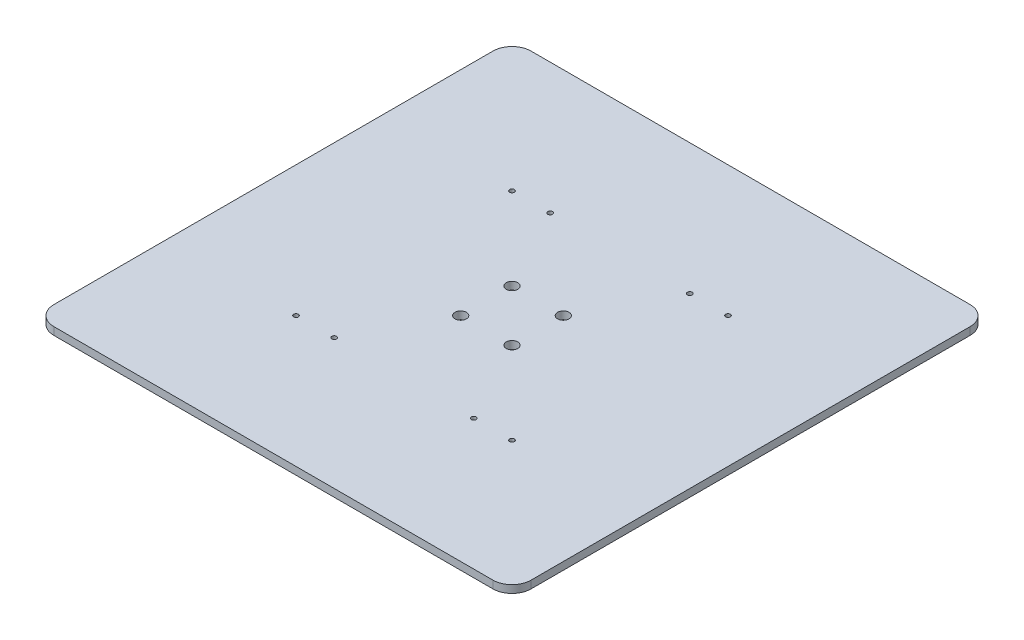
ISO-10303-21;
HEADER;
FILE_DESCRIPTION(('STEP AP214'),'2;1');
FILE_NAME('part.step','',(''),(''),'','','');
FILE_SCHEMA(('AUTOMOTIVE_DESIGN { 1 0 10303 214 1 1 1 1 }'));
ENDSEC;
DATA;
#1=APPLICATION_CONTEXT('core data for automotive mechanical design processes');
#2=APPLICATION_PROTOCOL_DEFINITION('international standard','automotive_design',2000,#1);
#3=PRODUCT_CONTEXT('',#1,'mechanical');
#4=PRODUCT('Part','Part','',(#3));
#5=PRODUCT_RELATED_PRODUCT_CATEGORY('part','',(#4));
#6=PRODUCT_DEFINITION_FORMATION('','',#4);
#7=PRODUCT_DEFINITION_CONTEXT('part definition',#1,'design');
#8=PRODUCT_DEFINITION('design','',#6,#7);
#9=PRODUCT_DEFINITION_SHAPE('','',#8);
#10=(LENGTH_UNIT() NAMED_UNIT(*) SI_UNIT(.MILLI.,.METRE.));
#11=(NAMED_UNIT(*) PLANE_ANGLE_UNIT() SI_UNIT($,.RADIAN.));
#12=(NAMED_UNIT(*) SI_UNIT($,.STERADIAN.) SOLID_ANGLE_UNIT());
#13=UNCERTAINTY_MEASURE_WITH_UNIT(LENGTH_MEASURE(1.E-05),#10,'distance_accuracy_value','');
#14=(GEOMETRIC_REPRESENTATION_CONTEXT(3) GLOBAL_UNCERTAINTY_ASSIGNED_CONTEXT((#13)) GLOBAL_UNIT_ASSIGNED_CONTEXT((#10,
#11,#12)) REPRESENTATION_CONTEXT('',''));
#15=CARTESIAN_POINT('',(0.,0.,0.));
#16=DIRECTION('',(0.,0.,1.));
#17=DIRECTION('',(1.,0.,0.));
#18=AXIS2_PLACEMENT_3D('',#15,#16,#17);
#19=CARTESIAN_POINT('',(125.,4.,-125.));
#20=DIRECTION('',(-1.,0.,0.));
#21=DIRECTION('',(0.,0.,1.));
#22=AXIS2_PLACEMENT_3D('',#19,#20,#21);
#23=PLANE('',#22);
#24=DIRECTION('',(0.,0.,-1.));
#25=VECTOR('',#24,1.);
#26=CARTESIAN_POINT('',(125.,4.,-125.));
#27=LINE('',#26,#25);
#28=CARTESIAN_POINT('',(125.,4.,115.));
#29=VERTEX_POINT('',#28);
#30=CARTESIAN_POINT('',(125.,4.,-115.));
#31=VERTEX_POINT('',#30);
#32=EDGE_CURVE('E140',#29,#31,#27,.T.);
#33=ORIENTED_EDGE('',*,*,#32,.F.);
#34=DIRECTION('',(0.,-1.,0.));
#35=VECTOR('',#34,1.);
#36=CARTESIAN_POINT('',(125.,4.,115.));
#37=LINE('',#36,#35);
#38=CARTESIAN_POINT('',(125.,0.,115.));
#39=VERTEX_POINT('',#38);
#40=EDGE_CURVE('E181',#29,#39,#37,.T.);
#41=ORIENTED_EDGE('',*,*,#40,.T.);
#42=DIRECTION('',(0.,0.,-1.));
#43=VECTOR('',#42,1.);
#44=CARTESIAN_POINT('',(125.,0.,-125.));
#45=LINE('',#44,#43);
#46=CARTESIAN_POINT('',(125.,0.,-115.));
#47=VERTEX_POINT('',#46);
#48=EDGE_CURVE('E263',#39,#47,#45,.T.);
#49=ORIENTED_EDGE('',*,*,#48,.T.);
#50=DIRECTION('',(0.,-1.,0.));
#51=VECTOR('',#50,1.);
#52=CARTESIAN_POINT('',(125.,4.,-115.));
#53=LINE('',#52,#51);
#54=EDGE_CURVE('E178',#47,#31,#53,.F.);
#55=ORIENTED_EDGE('',*,*,#54,.T.);
#56=EDGE_LOOP('',(#33,#41,#49,#55));
#57=FACE_BOUND('',#56,.T.);
#58=ADVANCED_FACE('F44',(#57),#23,.F.);
#59=CARTESIAN_POINT('',(-125.,4.,-125.));
#60=DIRECTION('',(0.,0.,1.));
#61=DIRECTION('',(1.,0.,0.));
#62=AXIS2_PLACEMENT_3D('',#59,#60,#61);
#63=PLANE('',#62);
#64=DIRECTION('',(-1.,0.,0.));
#65=VECTOR('',#64,1.);
#66=CARTESIAN_POINT('',(-125.,4.,-125.));
#67=LINE('',#66,#65);
#68=CARTESIAN_POINT('',(115.,4.,-125.));
#69=VERTEX_POINT('',#68);
#70=CARTESIAN_POINT('',(-115.,4.,-125.));
#71=VERTEX_POINT('',#70);
#72=EDGE_CURVE('E146',#69,#71,#67,.T.);
#73=ORIENTED_EDGE('',*,*,#72,.F.);
#74=DIRECTION('',(0.,-1.,0.));
#75=VECTOR('',#74,1.);
#76=CARTESIAN_POINT('',(115.,4.,-125.));
#77=LINE('',#76,#75);
#78=CARTESIAN_POINT('',(115.,0.,-125.));
#79=VERTEX_POINT('',#78);
#80=EDGE_CURVE('E11',#69,#79,#77,.T.);
#81=ORIENTED_EDGE('',*,*,#80,.T.);
#82=DIRECTION('',(-1.,0.,0.));
#83=VECTOR('',#82,1.);
#84=CARTESIAN_POINT('',(-125.,0.,-125.));
#85=LINE('',#84,#83);
#86=CARTESIAN_POINT('',(-115.,0.,-125.));
#87=VERTEX_POINT('',#86);
#88=EDGE_CURVE('E149',#79,#87,#85,.T.);
#89=ORIENTED_EDGE('',*,*,#88,.T.);
#90=DIRECTION('',(0.,-1.,0.));
#91=VECTOR('',#90,1.);
#92=CARTESIAN_POINT('',(-115.,4.,-125.));
#93=LINE('',#92,#91);
#94=EDGE_CURVE('E53',#87,#71,#93,.F.);
#95=ORIENTED_EDGE('',*,*,#94,.T.);
#96=EDGE_LOOP('',(#73,#81,#89,#95));
#97=FACE_BOUND('',#96,.T.);
#98=ADVANCED_FACE('F276',(#97),#63,.F.);
#99=CARTESIAN_POINT('',(-125.,4.,-125.));
#100=DIRECTION('',(1.,0.,0.));
#101=DIRECTION('',(0.,0.,-1.));
#102=AXIS2_PLACEMENT_3D('',#99,#100,#101);
#103=PLANE('',#102);
#104=DIRECTION('',(0.,0.,1.));
#105=VECTOR('',#104,1.);
#106=CARTESIAN_POINT('',(-125.,0.,-125.));
#107=LINE('',#106,#105);
#108=CARTESIAN_POINT('',(-125.,0.,-115.));
#109=VERTEX_POINT('',#108);
#110=CARTESIAN_POINT('',(-125.,0.,115.));
#111=VERTEX_POINT('',#110);
#112=EDGE_CURVE('E141',#109,#111,#107,.T.);
#113=ORIENTED_EDGE('',*,*,#112,.T.);
#114=DIRECTION('',(0.,-1.,0.));
#115=VECTOR('',#114,1.);
#116=CARTESIAN_POINT('',(-125.,4.,115.));
#117=LINE('',#116,#115);
#118=CARTESIAN_POINT('',(-125.,4.,115.));
#119=VERTEX_POINT('',#118);
#120=EDGE_CURVE('E116',#111,#119,#117,.F.);
#121=ORIENTED_EDGE('',*,*,#120,.T.);
#122=DIRECTION('',(0.,0.,1.));
#123=VECTOR('',#122,1.);
#124=CARTESIAN_POINT('',(-125.,4.,-125.));
#125=LINE('',#124,#123);
#126=CARTESIAN_POINT('',(-125.,4.,-115.));
#127=VERTEX_POINT('',#126);
#128=EDGE_CURVE('E187',#127,#119,#125,.T.);
#129=ORIENTED_EDGE('',*,*,#128,.F.);
#130=DIRECTION('',(0.,-1.,0.));
#131=VECTOR('',#130,1.);
#132=CARTESIAN_POINT('',(-125.,4.,-115.));
#133=LINE('',#132,#131);
#134=EDGE_CURVE('E122',#127,#109,#133,.T.);
#135=ORIENTED_EDGE('',*,*,#134,.T.);
#136=EDGE_LOOP('',(#113,#121,#129,#135));
#137=FACE_BOUND('',#136,.T.);
#138=ADVANCED_FACE('F284',(#137),#103,.F.);
#139=CARTESIAN_POINT('',(-125.,4.,125.));
#140=DIRECTION('',(0.,0.,-1.));
#141=DIRECTION('',(-1.,0.,0.));
#142=AXIS2_PLACEMENT_3D('',#139,#140,#141);
#143=PLANE('',#142);
#144=DIRECTION('',(1.,0.,0.));
#145=VECTOR('',#144,1.);
#146=CARTESIAN_POINT('',(-125.,4.,125.));
#147=LINE('',#146,#145);
#148=CARTESIAN_POINT('',(-115.,4.,125.));
#149=VERTEX_POINT('',#148);
#150=CARTESIAN_POINT('',(115.,4.,125.));
#151=VERTEX_POINT('',#150);
#152=EDGE_CURVE('E132',#149,#151,#147,.T.);
#153=ORIENTED_EDGE('',*,*,#152,.F.);
#154=DIRECTION('',(0.,-1.,0.));
#155=VECTOR('',#154,1.);
#156=CARTESIAN_POINT('',(-115.,4.,125.));
#157=LINE('',#156,#155);
#158=CARTESIAN_POINT('',(-115.,0.,125.));
#159=VERTEX_POINT('',#158);
#160=EDGE_CURVE('E115',#149,#159,#157,.T.);
#161=ORIENTED_EDGE('',*,*,#160,.T.);
#162=DIRECTION('',(1.,0.,0.));
#163=VECTOR('',#162,1.);
#164=CARTESIAN_POINT('',(-125.,0.,125.));
#165=LINE('',#164,#163);
#166=CARTESIAN_POINT('',(115.,0.,125.));
#167=VERTEX_POINT('',#166);
#168=EDGE_CURVE('E129',#159,#167,#165,.T.);
#169=ORIENTED_EDGE('',*,*,#168,.T.);
#170=DIRECTION('',(0.,-1.,0.));
#171=VECTOR('',#170,1.);
#172=CARTESIAN_POINT('',(115.,4.,125.));
#173=LINE('',#172,#171);
#174=EDGE_CURVE('E135',#167,#151,#173,.F.);
#175=ORIENTED_EDGE('',*,*,#174,.T.);
#176=EDGE_LOOP('',(#153,#161,#169,#175));
#177=FACE_BOUND('',#176,.T.);
#178=ADVANCED_FACE('F128',(#177),#143,.F.);
#179=CARTESIAN_POINT('',(0.,4.,0.));
#180=DIRECTION('',(0.,1.,0.));
#181=DIRECTION('',(0.,0.,1.));
#182=AXIS2_PLACEMENT_3D('',#179,#180,#181);
#183=PLANE('',#182);
#184=CARTESIAN_POINT('',(-13.4350288425443,4.,13.4350288425445));
#185=DIRECTION('',(0.,1.,0.));
#186=DIRECTION('',(0.,0.,1.));
#187=AXIS2_PLACEMENT_3D('',#184,#185,#186);
#188=CIRCLE('',#187,3.);
#189=CARTESIAN_POINT('',(-13.4350288425443,4.,16.4350288425445));
#190=VERTEX_POINT('',#189);
#191=EDGE_CURVE('E227',#190,#190,#188,.T.);
#192=ORIENTED_EDGE('',*,*,#191,.F.);
#193=EDGE_LOOP('',(#192));
#194=FACE_BOUND('',#193,.T.);
#195=CARTESIAN_POINT('',(-13.4350288425445,4.,-13.4350288425443));
#196=DIRECTION('',(0.,1.,0.));
#197=DIRECTION('',(0.,0.,1.));
#198=AXIS2_PLACEMENT_3D('',#195,#196,#197);
#199=CIRCLE('',#198,3.);
#200=CARTESIAN_POINT('',(-13.4350288425445,4.,-10.4350288425443));
#201=VERTEX_POINT('',#200);
#202=EDGE_CURVE('E204',#201,#201,#199,.T.);
#203=ORIENTED_EDGE('',*,*,#202,.F.);
#204=EDGE_LOOP('',(#203));
#205=FACE_BOUND('',#204,.T.);
#206=CARTESIAN_POINT('',(13.4350288425444,4.,-13.4350288425444));
#207=DIRECTION('',(0.,1.,0.));
#208=DIRECTION('',(0.,0.,1.));
#209=AXIS2_PLACEMENT_3D('',#206,#207,#208);
#210=CIRCLE('',#209,3.);
#211=CARTESIAN_POINT('',(13.4350288425444,4.,-10.4350288425444));
#212=VERTEX_POINT('',#211);
#213=EDGE_CURVE('E201',#212,#212,#210,.T.);
#214=ORIENTED_EDGE('',*,*,#213,.F.);
#215=EDGE_LOOP('',(#214));
#216=FACE_BOUND('',#215,.T.);
#217=CARTESIAN_POINT('',(13.4350288425444,4.,13.4350288425444));
#218=DIRECTION('',(0.,1.,0.));
#219=DIRECTION('',(0.,0.,1.));
#220=AXIS2_PLACEMENT_3D('',#217,#218,#219);
#221=CIRCLE('',#220,3.);
#222=CARTESIAN_POINT('',(13.4350288425444,4.,16.4350288425444));
#223=VERTEX_POINT('',#222);
#224=EDGE_CURVE('E205',#223,#223,#221,.T.);
#225=ORIENTED_EDGE('',*,*,#224,.F.);
#226=EDGE_LOOP('',(#225));
#227=FACE_BOUND('',#226,.T.);
#228=CARTESIAN_POINT('',(36.5685424949238,4.,56.5685424949237));
#229=DIRECTION('',(0.,1.,0.));
#230=DIRECTION('',(0.,0.,1.));
#231=AXIS2_PLACEMENT_3D('',#228,#229,#230);
#232=CIRCLE('',#231,1.25);
#233=CARTESIAN_POINT('',(36.5685424949238,4.,57.8185424949237));
#234=VERTEX_POINT('',#233);
#235=EDGE_CURVE('E241',#234,#234,#232,.T.);
#236=ORIENTED_EDGE('',*,*,#235,.F.);
#237=EDGE_LOOP('',(#236));
#238=FACE_BOUND('',#237,.T.);
#239=CARTESIAN_POINT('',(-36.5774411816182,4.,-56.5774411816182));
#240=DIRECTION('',(0.,1.,0.));
#241=DIRECTION('',(0.,0.,1.));
#242=AXIS2_PLACEMENT_3D('',#239,#240,#241);
#243=CIRCLE('',#242,1.25);
#244=CARTESIAN_POINT('',(-36.5774411816182,4.,-55.3274411816182));
#245=VERTEX_POINT('',#244);
#246=EDGE_CURVE('E237',#245,#245,#243,.T.);
#247=ORIENTED_EDGE('',*,*,#246,.F.);
#248=EDGE_LOOP('',(#247));
#249=FACE_BOUND('',#248,.T.);
#250=CARTESIAN_POINT('',(36.5685424949244,4.,-56.5774411816177));
#251=DIRECTION('',(0.,1.,0.));
#252=DIRECTION('',(0.,0.,1.));
#253=AXIS2_PLACEMENT_3D('',#250,#251,#252);
#254=CIRCLE('',#253,1.25);
#255=CARTESIAN_POINT('',(36.5685424949244,4.,-55.3274411816177));
#256=VERTEX_POINT('',#255);
#257=EDGE_CURVE('E233',#256,#256,#254,.T.);
#258=ORIENTED_EDGE('',*,*,#257,.F.);
#259=EDGE_LOOP('',(#258));
#260=FACE_BOUND('',#259,.T.);
#261=CARTESIAN_POINT('',(-36.5774411816184,4.,56.5685424949236));
#262=DIRECTION('',(0.,1.,0.));
#263=DIRECTION('',(0.,0.,1.));
#264=AXIS2_PLACEMENT_3D('',#261,#262,#263);
#265=CIRCLE('',#264,1.25);
#266=CARTESIAN_POINT('',(-36.5774411816184,4.,57.8185424949236));
#267=VERTEX_POINT('',#266);
#268=EDGE_CURVE('E198',#267,#267,#265,.T.);
#269=ORIENTED_EDGE('',*,*,#268,.F.);
#270=EDGE_LOOP('',(#269));
#271=FACE_BOUND('',#270,.T.);
#272=CARTESIAN_POINT('',(-56.5774411816184,4.,56.5685424949236));
#273=DIRECTION('',(0.,-1.,0.));
#274=DIRECTION('',(1.,0.,0.));
#275=AXIS2_PLACEMENT_3D('',#272,#273,#274);
#276=CIRCLE('',#275,1.25);
#277=CARTESIAN_POINT('',(-55.3274411816184,4.,56.5685424949236));
#278=VERTEX_POINT('',#277);
#279=EDGE_CURVE('E245',#278,#278,#276,.T.);
#280=ORIENTED_EDGE('',*,*,#279,.T.);
#281=EDGE_LOOP('',(#280));
#282=FACE_BOUND('',#281,.T.);
#283=CARTESIAN_POINT('',(-56.5774411816182,4.,-56.5774411816182));
#284=DIRECTION('',(0.,-1.,0.));
#285=DIRECTION('',(0.,0.,1.));
#286=AXIS2_PLACEMENT_3D('',#283,#284,#285);
#287=CIRCLE('',#286,1.25);
#288=CARTESIAN_POINT('',(-56.5774411816182,4.,-55.3274411816182));
#289=VERTEX_POINT('',#288);
#290=EDGE_CURVE('E207',#289,#289,#287,.T.);
#291=ORIENTED_EDGE('',*,*,#290,.T.);
#292=EDGE_LOOP('',(#291));
#293=FACE_BOUND('',#292,.T.);
#294=CARTESIAN_POINT('',(56.5685424949244,4.,-56.5774411816176));
#295=DIRECTION('',(0.,-1.,0.));
#296=DIRECTION('',(-1.,0.,0.));
#297=AXIS2_PLACEMENT_3D('',#294,#295,#296);
#298=CIRCLE('',#297,1.25);
#299=CARTESIAN_POINT('',(55.3185424949244,4.,-56.5774411816176));
#300=VERTEX_POINT('',#299);
#301=EDGE_CURVE('E214',#300,#300,#298,.T.);
#302=ORIENTED_EDGE('',*,*,#301,.T.);
#303=EDGE_LOOP('',(#302));
#304=FACE_BOUND('',#303,.T.);
#305=CARTESIAN_POINT('',(56.5685424949238,4.,56.5685424949238));
#306=DIRECTION('',(0.,-1.,0.));
#307=DIRECTION('',(0.,0.,-1.));
#308=AXIS2_PLACEMENT_3D('',#305,#306,#307);
#309=CIRCLE('',#308,1.25);
#310=CARTESIAN_POINT('',(56.5685424949238,4.,55.3185424949238));
#311=VERTEX_POINT('',#310);
#312=EDGE_CURVE('E259',#311,#311,#309,.T.);
#313=ORIENTED_EDGE('',*,*,#312,.T.);
#314=EDGE_LOOP('',(#313));
#315=FACE_BOUND('',#314,.T.);
#316=ORIENTED_EDGE('',*,*,#128,.T.);
#317=CARTESIAN_POINT('',(-115.,4.,115.));
#318=DIRECTION('',(0.,1.,0.));
#319=DIRECTION('',(0.,0.,1.));
#320=AXIS2_PLACEMENT_3D('',#317,#318,#319);
#321=CIRCLE('',#320,10.);
#322=EDGE_CURVE('E175',#119,#149,#321,.T.);
#323=ORIENTED_EDGE('',*,*,#322,.T.);
#324=ORIENTED_EDGE('',*,*,#152,.T.);
#325=CARTESIAN_POINT('',(115.,4.,115.));
#326=DIRECTION('',(0.,1.,0.));
#327=DIRECTION('',(0.,0.,1.));
#328=AXIS2_PLACEMENT_3D('',#325,#326,#327);
#329=CIRCLE('',#328,10.);
#330=EDGE_CURVE('E172',#151,#29,#329,.T.);
#331=ORIENTED_EDGE('',*,*,#330,.T.);
#332=ORIENTED_EDGE('',*,*,#32,.T.);
#333=CARTESIAN_POINT('',(115.,4.,-115.));
#334=DIRECTION('',(0.,1.,0.));
#335=DIRECTION('',(0.,0.,1.));
#336=AXIS2_PLACEMENT_3D('',#333,#334,#335);
#337=CIRCLE('',#336,10.);
#338=EDGE_CURVE('E66',#31,#69,#337,.T.);
#339=ORIENTED_EDGE('',*,*,#338,.T.);
#340=ORIENTED_EDGE('',*,*,#72,.T.);
#341=CARTESIAN_POINT('',(-115.,4.,-115.));
#342=DIRECTION('',(0.,1.,0.));
#343=DIRECTION('',(0.,0.,1.));
#344=AXIS2_PLACEMENT_3D('',#341,#342,#343);
#345=CIRCLE('',#344,10.);
#346=EDGE_CURVE('E167',#71,#127,#345,.T.);
#347=ORIENTED_EDGE('',*,*,#346,.T.);
#348=EDGE_LOOP('',(#316,#323,#324,#331,#332,#339,#340,#347));
#349=FACE_BOUND('',#348,.T.);
#350=ADVANCED_FACE('F282',(#194,#205,#216,#227,#238,#249,#260,#271,#282,#293,#304,#315,#349),
#183,.T.);
#351=CARTESIAN_POINT('',(0.,0.,0.));
#352=DIRECTION('',(0.,1.,0.));
#353=DIRECTION('',(0.,0.,1.));
#354=AXIS2_PLACEMENT_3D('',#351,#352,#353);
#355=PLANE('',#354);
#356=CARTESIAN_POINT('',(-13.4350288425443,0.,13.4350288425445));
#357=DIRECTION('',(0.,-1.,0.));
#358=DIRECTION('',(0.,0.,-1.));
#359=AXIS2_PLACEMENT_3D('',#356,#357,#358);
#360=CIRCLE('',#359,3.);
#361=CARTESIAN_POINT('',(-13.4350288425443,0.,10.4350288425445));
#362=VERTEX_POINT('',#361);
#363=EDGE_CURVE('E193',#362,#362,#360,.T.);
#364=ORIENTED_EDGE('',*,*,#363,.F.);
#365=EDGE_LOOP('',(#364));
#366=FACE_BOUND('',#365,.T.);
#367=CARTESIAN_POINT('',(-13.4350288425445,0.,-13.4350288425443));
#368=DIRECTION('',(0.,-1.,0.));
#369=DIRECTION('',(0.,0.,-1.));
#370=AXIS2_PLACEMENT_3D('',#367,#368,#369);
#371=CIRCLE('',#370,3.);
#372=CARTESIAN_POINT('',(-13.4350288425445,0.,-16.4350288425443));
#373=VERTEX_POINT('',#372);
#374=EDGE_CURVE('E189',#373,#373,#371,.T.);
#375=ORIENTED_EDGE('',*,*,#374,.F.);
#376=EDGE_LOOP('',(#375));
#377=FACE_BOUND('',#376,.T.);
#378=CARTESIAN_POINT('',(13.4350288425444,0.,-13.4350288425444));
#379=DIRECTION('',(0.,-1.,0.));
#380=DIRECTION('',(0.,0.,-1.));
#381=AXIS2_PLACEMENT_3D('',#378,#379,#380);
#382=CIRCLE('',#381,3.);
#383=CARTESIAN_POINT('',(13.4350288425444,0.,-16.4350288425444));
#384=VERTEX_POINT('',#383);
#385=EDGE_CURVE('E192',#384,#384,#382,.T.);
#386=ORIENTED_EDGE('',*,*,#385,.F.);
#387=EDGE_LOOP('',(#386));
#388=FACE_BOUND('',#387,.T.);
#389=CARTESIAN_POINT('',(13.4350288425444,0.,13.4350288425444));
#390=DIRECTION('',(0.,-1.,0.));
#391=DIRECTION('',(0.,0.,-1.));
#392=AXIS2_PLACEMENT_3D('',#389,#390,#391);
#393=CIRCLE('',#392,3.);
#394=CARTESIAN_POINT('',(13.4350288425444,0.,10.4350288425444));
#395=VERTEX_POINT('',#394);
#396=EDGE_CURVE('E349',#395,#395,#393,.T.);
#397=ORIENTED_EDGE('',*,*,#396,.F.);
#398=EDGE_LOOP('',(#397));
#399=FACE_BOUND('',#398,.T.);
#400=CARTESIAN_POINT('',(36.5685424949238,0.,56.5685424949237));
#401=DIRECTION('',(0.,-1.,0.));
#402=DIRECTION('',(0.,0.,-1.));
#403=AXIS2_PLACEMENT_3D('',#400,#401,#402);
#404=CIRCLE('',#403,1.25);
#405=CARTESIAN_POINT('',(36.5685424949238,0.,55.3185424949237));
#406=VERTEX_POINT('',#405);
#407=EDGE_CURVE('E199',#406,#406,#404,.T.);
#408=ORIENTED_EDGE('',*,*,#407,.F.);
#409=EDGE_LOOP('',(#408));
#410=FACE_BOUND('',#409,.T.);
#411=CARTESIAN_POINT('',(-36.5774411816182,0.,-56.5774411816182));
#412=DIRECTION('',(0.,-1.,0.));
#413=DIRECTION('',(0.,0.,-1.));
#414=AXIS2_PLACEMENT_3D('',#411,#412,#413);
#415=CIRCLE('',#414,1.25);
#416=CARTESIAN_POINT('',(-36.5774411816182,0.,-57.8274411816182));
#417=VERTEX_POINT('',#416);
#418=EDGE_CURVE('E216',#417,#417,#415,.T.);
#419=ORIENTED_EDGE('',*,*,#418,.F.);
#420=EDGE_LOOP('',(#419));
#421=FACE_BOUND('',#420,.T.);
#422=CARTESIAN_POINT('',(36.5685424949244,0.,-56.5774411816177));
#423=DIRECTION('',(0.,-1.,0.));
#424=DIRECTION('',(0.,0.,-1.));
#425=AXIS2_PLACEMENT_3D('',#422,#423,#424);
#426=CIRCLE('',#425,1.25);
#427=CARTESIAN_POINT('',(36.5685424949244,0.,-57.8274411816177));
#428=VERTEX_POINT('',#427);
#429=EDGE_CURVE('E218',#428,#428,#426,.T.);
#430=ORIENTED_EDGE('',*,*,#429,.F.);
#431=EDGE_LOOP('',(#430));
#432=FACE_BOUND('',#431,.T.);
#433=CARTESIAN_POINT('',(-36.5774411816184,0.,56.5685424949236));
#434=DIRECTION('',(0.,-1.,0.));
#435=DIRECTION('',(0.,0.,-1.));
#436=AXIS2_PLACEMENT_3D('',#433,#434,#435);
#437=CIRCLE('',#436,1.25);
#438=CARTESIAN_POINT('',(-36.5774411816184,0.,55.3185424949236));
#439=VERTEX_POINT('',#438);
#440=EDGE_CURVE('E195',#439,#439,#437,.T.);
#441=ORIENTED_EDGE('',*,*,#440,.F.);
#442=EDGE_LOOP('',(#441));
#443=FACE_BOUND('',#442,.T.);
#444=CARTESIAN_POINT('',(-56.5774411816184,0.,56.5685424949236));
#445=DIRECTION('',(0.,-1.,0.));
#446=DIRECTION('',(1.,0.,0.));
#447=AXIS2_PLACEMENT_3D('',#444,#445,#446);
#448=CIRCLE('',#447,1.25);
#449=CARTESIAN_POINT('',(-55.3274411816184,0.,56.5685424949236));
#450=VERTEX_POINT('',#449);
#451=EDGE_CURVE('E209',#450,#450,#448,.T.);
#452=ORIENTED_EDGE('',*,*,#451,.F.);
#453=EDGE_LOOP('',(#452));
#454=FACE_BOUND('',#453,.T.);
#455=CARTESIAN_POINT('',(-56.5774411816182,0.,-56.5774411816182));
#456=DIRECTION('',(0.,-1.,0.));
#457=DIRECTION('',(0.,0.,1.));
#458=AXIS2_PLACEMENT_3D('',#455,#456,#457);
#459=CIRCLE('',#458,1.25);
#460=CARTESIAN_POINT('',(-56.5774411816182,0.,-55.3274411816182));
#461=VERTEX_POINT('',#460);
#462=EDGE_CURVE('E210',#461,#461,#459,.T.);
#463=ORIENTED_EDGE('',*,*,#462,.F.);
#464=EDGE_LOOP('',(#463));
#465=FACE_BOUND('',#464,.T.);
#466=CARTESIAN_POINT('',(56.5685424949244,0.,-56.5774411816176));
#467=DIRECTION('',(0.,-1.,0.));
#468=DIRECTION('',(-1.,0.,0.));
#469=AXIS2_PLACEMENT_3D('',#466,#467,#468);
#470=CIRCLE('',#469,1.25);
#471=CARTESIAN_POINT('',(55.3185424949244,0.,-56.5774411816176));
#472=VERTEX_POINT('',#471);
#473=EDGE_CURVE('E244',#472,#472,#470,.T.);
#474=ORIENTED_EDGE('',*,*,#473,.F.);
#475=EDGE_LOOP('',(#474));
#476=FACE_BOUND('',#475,.T.);
#477=CARTESIAN_POINT('',(56.5685424949238,0.,56.5685424949238));
#478=DIRECTION('',(0.,-1.,0.));
#479=DIRECTION('',(0.,0.,-1.));
#480=AXIS2_PLACEMENT_3D('',#477,#478,#479);
#481=CIRCLE('',#480,1.25);
#482=CARTESIAN_POINT('',(56.5685424949238,0.,55.3185424949238));
#483=VERTEX_POINT('',#482);
#484=EDGE_CURVE('E249',#483,#483,#481,.T.);
#485=ORIENTED_EDGE('',*,*,#484,.F.);
#486=EDGE_LOOP('',(#485));
#487=FACE_BOUND('',#486,.T.);
#488=ORIENTED_EDGE('',*,*,#168,.F.);
#489=CARTESIAN_POINT('',(-115.,0.,115.));
#490=DIRECTION('',(0.,1.,0.));
#491=DIRECTION('',(0.,0.,1.));
#492=AXIS2_PLACEMENT_3D('',#489,#490,#491);
#493=CIRCLE('',#492,10.);
#494=EDGE_CURVE('E111',#159,#111,#493,.F.);
#495=ORIENTED_EDGE('',*,*,#494,.T.);
#496=ORIENTED_EDGE('',*,*,#112,.F.);
#497=CARTESIAN_POINT('',(-115.,0.,-115.));
#498=DIRECTION('',(0.,1.,0.));
#499=DIRECTION('',(0.,0.,1.));
#500=AXIS2_PLACEMENT_3D('',#497,#498,#499);
#501=CIRCLE('',#500,10.);
#502=EDGE_CURVE('E134',#109,#87,#501,.F.);
#503=ORIENTED_EDGE('',*,*,#502,.T.);
#504=ORIENTED_EDGE('',*,*,#88,.F.);
#505=CARTESIAN_POINT('',(115.,0.,-115.));
#506=DIRECTION('',(0.,1.,0.));
#507=DIRECTION('',(0.,0.,1.));
#508=AXIS2_PLACEMENT_3D('',#505,#506,#507);
#509=CIRCLE('',#508,10.);
#510=EDGE_CURVE('E157',#79,#47,#509,.F.);
#511=ORIENTED_EDGE('',*,*,#510,.T.);
#512=ORIENTED_EDGE('',*,*,#48,.F.);
#513=CARTESIAN_POINT('',(115.,0.,115.));
#514=DIRECTION('',(0.,1.,0.));
#515=DIRECTION('',(0.,0.,1.));
#516=AXIS2_PLACEMENT_3D('',#513,#514,#515);
#517=CIRCLE('',#516,10.);
#518=EDGE_CURVE('E123',#39,#167,#517,.F.);
#519=ORIENTED_EDGE('',*,*,#518,.T.);
#520=EDGE_LOOP('',(#488,#495,#496,#503,#504,#511,#512,#519));
#521=FACE_BOUND('',#520,.T.);
#522=ADVANCED_FACE('F137',(#366,#377,#388,#399,#410,#421,#432,#443,#454,#465,#476,#487,#521),
#355,.F.);
#523=CARTESIAN_POINT('',(-115.,4.,115.));
#524=DIRECTION('',(0.,-1.,0.));
#525=DIRECTION('',(0.,0.,-1.));
#526=AXIS2_PLACEMENT_3D('',#523,#524,#525);
#527=CYLINDRICAL_SURFACE('',#526,10.);
#528=ORIENTED_EDGE('',*,*,#322,.F.);
#529=ORIENTED_EDGE('',*,*,#120,.F.);
#530=ORIENTED_EDGE('',*,*,#494,.F.);
#531=ORIENTED_EDGE('',*,*,#160,.F.);
#532=EDGE_LOOP('',(#528,#529,#530,#531));
#533=FACE_BOUND('',#532,.T.);
#534=ADVANCED_FACE('F114',(#533),#527,.T.);
#535=CARTESIAN_POINT('',(115.,4.,115.));
#536=DIRECTION('',(0.,-1.,0.));
#537=DIRECTION('',(0.,0.,-1.));
#538=AXIS2_PLACEMENT_3D('',#535,#536,#537);
#539=CYLINDRICAL_SURFACE('',#538,10.);
#540=ORIENTED_EDGE('',*,*,#330,.F.);
#541=ORIENTED_EDGE('',*,*,#174,.F.);
#542=ORIENTED_EDGE('',*,*,#518,.F.);
#543=ORIENTED_EDGE('',*,*,#40,.F.);
#544=EDGE_LOOP('',(#540,#541,#542,#543));
#545=FACE_BOUND('',#544,.T.);
#546=ADVANCED_FACE('F302',(#545),#539,.T.);
#547=CARTESIAN_POINT('',(115.,4.,-115.));
#548=DIRECTION('',(0.,-1.,0.));
#549=DIRECTION('',(0.,0.,-1.));
#550=AXIS2_PLACEMENT_3D('',#547,#548,#549);
#551=CYLINDRICAL_SURFACE('',#550,10.);
#552=ORIENTED_EDGE('',*,*,#338,.F.);
#553=ORIENTED_EDGE('',*,*,#54,.F.);
#554=ORIENTED_EDGE('',*,*,#510,.F.);
#555=ORIENTED_EDGE('',*,*,#80,.F.);
#556=EDGE_LOOP('',(#552,#553,#554,#555));
#557=FACE_BOUND('',#556,.T.);
#558=ADVANCED_FACE('F304',(#557),#551,.T.);
#559=CARTESIAN_POINT('',(-115.,4.,-115.));
#560=DIRECTION('',(0.,-1.,0.));
#561=DIRECTION('',(0.,0.,-1.));
#562=AXIS2_PLACEMENT_3D('',#559,#560,#561);
#563=CYLINDRICAL_SURFACE('',#562,10.);
#564=ORIENTED_EDGE('',*,*,#346,.F.);
#565=ORIENTED_EDGE('',*,*,#94,.F.);
#566=ORIENTED_EDGE('',*,*,#502,.F.);
#567=ORIENTED_EDGE('',*,*,#134,.F.);
#568=EDGE_LOOP('',(#564,#565,#566,#567));
#569=FACE_BOUND('',#568,.T.);
#570=ADVANCED_FACE('F46',(#569),#563,.T.);
#571=CARTESIAN_POINT('',(56.5685424949238,4.,56.5685424949238));
#572=DIRECTION('',(0.,-1.,0.));
#573=DIRECTION('',(0.,0.,-1.));
#574=AXIS2_PLACEMENT_3D('',#571,#572,#573);
#575=CYLINDRICAL_SURFACE('',#574,1.25);
#576=ORIENTED_EDGE('',*,*,#312,.F.);
#577=EDGE_LOOP('',(#576));
#578=FACE_BOUND('',#577,.T.);
#579=ORIENTED_EDGE('',*,*,#484,.T.);
#580=EDGE_LOOP('',(#579));
#581=FACE_BOUND('',#580,.T.);
#582=ADVANCED_FACE('F311',(#578,#581),#575,.F.);
#583=CARTESIAN_POINT('',(56.5685424949244,4.,-56.5774411816176));
#584=DIRECTION('',(0.,-1.,0.));
#585=DIRECTION('',(0.,0.,-1.));
#586=AXIS2_PLACEMENT_3D('',#583,#584,#585);
#587=CYLINDRICAL_SURFACE('',#586,1.25);
#588=ORIENTED_EDGE('',*,*,#301,.F.);
#589=EDGE_LOOP('',(#588));
#590=FACE_BOUND('',#589,.T.);
#591=ORIENTED_EDGE('',*,*,#473,.T.);
#592=EDGE_LOOP('',(#591));
#593=FACE_BOUND('',#592,.T.);
#594=ADVANCED_FACE('F318',(#590,#593),#587,.F.);
#595=CARTESIAN_POINT('',(-56.5774411816182,4.,-56.5774411816182));
#596=DIRECTION('',(0.,-1.,0.));
#597=DIRECTION('',(0.,0.,-1.));
#598=AXIS2_PLACEMENT_3D('',#595,#596,#597);
#599=CYLINDRICAL_SURFACE('',#598,1.25);
#600=ORIENTED_EDGE('',*,*,#290,.F.);
#601=EDGE_LOOP('',(#600));
#602=FACE_BOUND('',#601,.T.);
#603=ORIENTED_EDGE('',*,*,#462,.T.);
#604=EDGE_LOOP('',(#603));
#605=FACE_BOUND('',#604,.T.);
#606=ADVANCED_FACE('F324',(#602,#605),#599,.F.);
#607=CARTESIAN_POINT('',(-56.5774411816184,4.,56.5685424949236));
#608=DIRECTION('',(0.,-1.,0.));
#609=DIRECTION('',(0.,0.,-1.));
#610=AXIS2_PLACEMENT_3D('',#607,#608,#609);
#611=CYLINDRICAL_SURFACE('',#610,1.25);
#612=ORIENTED_EDGE('',*,*,#279,.F.);
#613=EDGE_LOOP('',(#612));
#614=FACE_BOUND('',#613,.T.);
#615=ORIENTED_EDGE('',*,*,#451,.T.);
#616=EDGE_LOOP('',(#615));
#617=FACE_BOUND('',#616,.T.);
#618=ADVANCED_FACE('F367',(#614,#617),#611,.F.);
#619=CARTESIAN_POINT('',(-36.5774411816184,10.,56.5685424949236));
#620=DIRECTION('',(0.,-1.,0.));
#621=DIRECTION('',(0.,0.,-1.));
#622=AXIS2_PLACEMENT_3D('',#619,#620,#621);
#623=CYLINDRICAL_SURFACE('',#622,1.25);
#624=ORIENTED_EDGE('',*,*,#268,.T.);
#625=EDGE_LOOP('',(#624));
#626=FACE_BOUND('',#625,.T.);
#627=ORIENTED_EDGE('',*,*,#440,.T.);
#628=EDGE_LOOP('',(#627));
#629=FACE_BOUND('',#628,.T.);
#630=ADVANCED_FACE('F372',(#626,#629),#623,.F.);
#631=CARTESIAN_POINT('',(36.5685424949244,10.,-56.5774411816177));
#632=DIRECTION('',(0.,-1.,0.));
#633=DIRECTION('',(0.,0.,-1.));
#634=AXIS2_PLACEMENT_3D('',#631,#632,#633);
#635=CYLINDRICAL_SURFACE('',#634,1.25);
#636=ORIENTED_EDGE('',*,*,#257,.T.);
#637=EDGE_LOOP('',(#636));
#638=FACE_BOUND('',#637,.T.);
#639=ORIENTED_EDGE('',*,*,#429,.T.);
#640=EDGE_LOOP('',(#639));
#641=FACE_BOUND('',#640,.T.);
#642=ADVANCED_FACE('F379',(#638,#641),#635,.F.);
#643=CARTESIAN_POINT('',(-36.5774411816182,10.,-56.5774411816182));
#644=DIRECTION('',(0.,-1.,0.));
#645=DIRECTION('',(0.,0.,-1.));
#646=AXIS2_PLACEMENT_3D('',#643,#644,#645);
#647=CYLINDRICAL_SURFACE('',#646,1.25);
#648=ORIENTED_EDGE('',*,*,#246,.T.);
#649=EDGE_LOOP('',(#648));
#650=FACE_BOUND('',#649,.T.);
#651=ORIENTED_EDGE('',*,*,#418,.T.);
#652=EDGE_LOOP('',(#651));
#653=FACE_BOUND('',#652,.T.);
#654=ADVANCED_FACE('F381',(#650,#653),#647,.F.);
#655=CARTESIAN_POINT('',(36.5685424949238,10.,56.5685424949237));
#656=DIRECTION('',(0.,-1.,0.));
#657=DIRECTION('',(0.,0.,-1.));
#658=AXIS2_PLACEMENT_3D('',#655,#656,#657);
#659=CYLINDRICAL_SURFACE('',#658,1.25);
#660=ORIENTED_EDGE('',*,*,#235,.T.);
#661=EDGE_LOOP('',(#660));
#662=FACE_BOUND('',#661,.T.);
#663=ORIENTED_EDGE('',*,*,#407,.T.);
#664=EDGE_LOOP('',(#663));
#665=FACE_BOUND('',#664,.T.);
#666=ADVANCED_FACE('F384',(#662,#665),#659,.F.);
#667=CARTESIAN_POINT('',(13.4350288425444,10.,13.4350288425444));
#668=DIRECTION('',(0.,-1.,0.));
#669=DIRECTION('',(0.,0.,-1.));
#670=AXIS2_PLACEMENT_3D('',#667,#668,#669);
#671=CYLINDRICAL_SURFACE('',#670,3.);
#672=ORIENTED_EDGE('',*,*,#224,.T.);
#673=EDGE_LOOP('',(#672));
#674=FACE_BOUND('',#673,.T.);
#675=ORIENTED_EDGE('',*,*,#396,.T.);
#676=EDGE_LOOP('',(#675));
#677=FACE_BOUND('',#676,.T.);
#678=ADVANCED_FACE('F388',(#674,#677),#671,.F.);
#679=CARTESIAN_POINT('',(13.4350288425444,10.,-13.4350288425444));
#680=DIRECTION('',(0.,-1.,0.));
#681=DIRECTION('',(0.,0.,-1.));
#682=AXIS2_PLACEMENT_3D('',#679,#680,#681);
#683=CYLINDRICAL_SURFACE('',#682,3.);
#684=ORIENTED_EDGE('',*,*,#213,.T.);
#685=EDGE_LOOP('',(#684));
#686=FACE_BOUND('',#685,.T.);
#687=ORIENTED_EDGE('',*,*,#385,.T.);
#688=EDGE_LOOP('',(#687));
#689=FACE_BOUND('',#688,.T.);
#690=ADVANCED_FACE('F395',(#686,#689),#683,.F.);
#691=CARTESIAN_POINT('',(-13.4350288425445,10.,-13.4350288425443));
#692=DIRECTION('',(0.,-1.,0.));
#693=DIRECTION('',(0.,0.,-1.));
#694=AXIS2_PLACEMENT_3D('',#691,#692,#693);
#695=CYLINDRICAL_SURFACE('',#694,3.);
#696=ORIENTED_EDGE('',*,*,#202,.T.);
#697=EDGE_LOOP('',(#696));
#698=FACE_BOUND('',#697,.T.);
#699=ORIENTED_EDGE('',*,*,#374,.T.);
#700=EDGE_LOOP('',(#699));
#701=FACE_BOUND('',#700,.T.);
#702=ADVANCED_FACE('F400',(#698,#701),#695,.F.);
#703=CARTESIAN_POINT('',(-13.4350288425443,10.,13.4350288425445));
#704=DIRECTION('',(0.,-1.,0.));
#705=DIRECTION('',(0.,0.,-1.));
#706=AXIS2_PLACEMENT_3D('',#703,#704,#705);
#707=CYLINDRICAL_SURFACE('',#706,3.);
#708=ORIENTED_EDGE('',*,*,#191,.T.);
#709=EDGE_LOOP('',(#708));
#710=FACE_BOUND('',#709,.T.);
#711=ORIENTED_EDGE('',*,*,#363,.T.);
#712=EDGE_LOOP('',(#711));
#713=FACE_BOUND('',#712,.T.);
#714=ADVANCED_FACE('F397',(#710,#713),#707,.F.);
#715=CLOSED_SHELL('',(#58,#98,#138,#178,#350,#522,#534,#546,#558,#570,#582,#594,#606,#618,#630,
#642,#654,#666,#678,#690,#702,#714));
#716=MANIFOLD_SOLID_BREP('B2',#715);
#717=ADVANCED_BREP_SHAPE_REPRESENTATION('',(#18,#716),#14);
#718=SHAPE_DEFINITION_REPRESENTATION(#9,#717);
ENDSEC;
END-ISO-10303-21;
